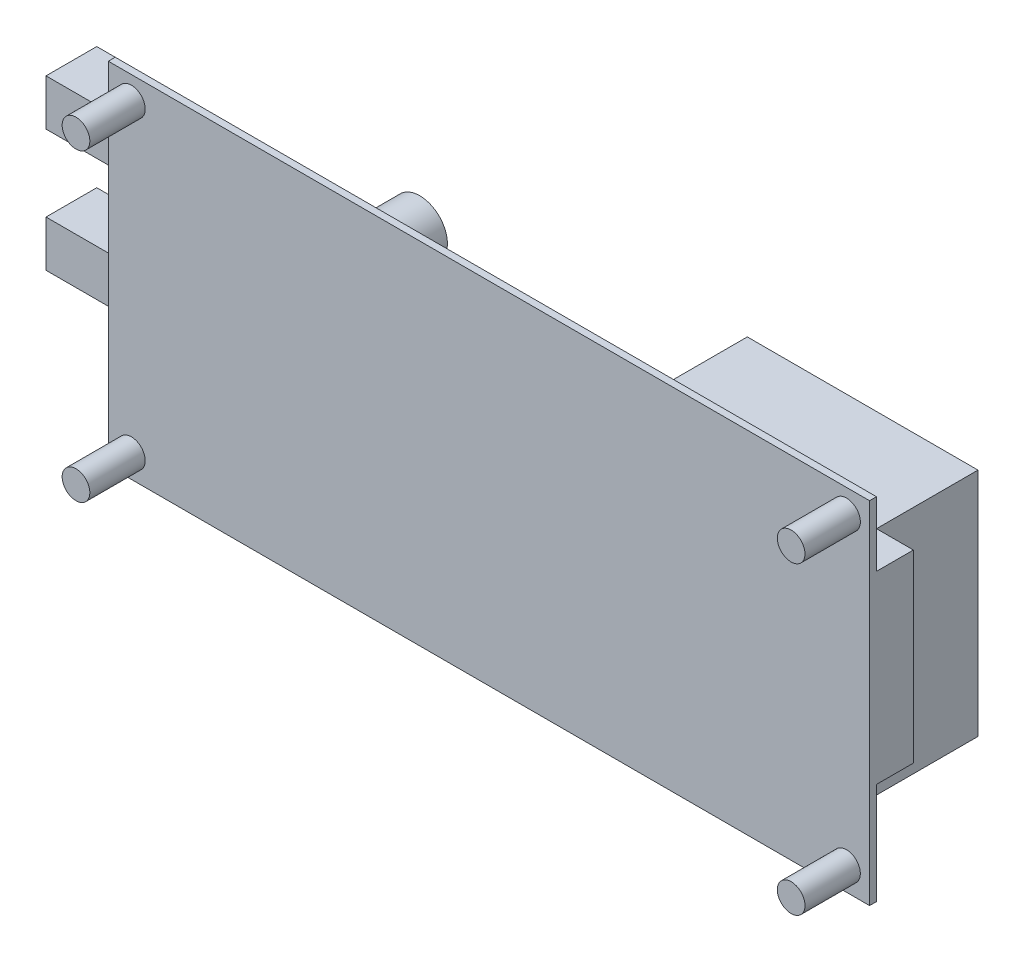
ISO-10303-21;
HEADER;
FILE_DESCRIPTION(('STEP AP214'),'2;1');
FILE_NAME('part.step','',(''),(''),'','','');
FILE_SCHEMA(('AUTOMOTIVE_DESIGN { 1 0 10303 214 1 1 1 1 }'));
ENDSEC;
DATA;
#1=APPLICATION_CONTEXT('core data for automotive mechanical design processes');
#2=APPLICATION_PROTOCOL_DEFINITION('international standard','automotive_design',2000,#1);
#3=PRODUCT_CONTEXT('',#1,'mechanical');
#4=PRODUCT('Part','Part','',(#3));
#5=PRODUCT_RELATED_PRODUCT_CATEGORY('part','',(#4));
#6=PRODUCT_DEFINITION_FORMATION('','',#4);
#7=PRODUCT_DEFINITION_CONTEXT('part definition',#1,'design');
#8=PRODUCT_DEFINITION('design','',#6,#7);
#9=PRODUCT_DEFINITION_SHAPE('','',#8);
#10=(LENGTH_UNIT() NAMED_UNIT(*) SI_UNIT(.MILLI.,.METRE.));
#11=(NAMED_UNIT(*) PLANE_ANGLE_UNIT() SI_UNIT($,.RADIAN.));
#12=(NAMED_UNIT(*) SI_UNIT($,.STERADIAN.) SOLID_ANGLE_UNIT());
#13=UNCERTAINTY_MEASURE_WITH_UNIT(LENGTH_MEASURE(1.E-05),#10,'distance_accuracy_value','');
#14=(GEOMETRIC_REPRESENTATION_CONTEXT(3) GLOBAL_UNCERTAINTY_ASSIGNED_CONTEXT((#13)) GLOBAL_UNIT_ASSIGNED_CONTEXT((#10,
#11,#12)) REPRESENTATION_CONTEXT('',''));
#15=CARTESIAN_POINT('',(0.,0.,0.));
#16=DIRECTION('',(0.,0.,1.));
#17=DIRECTION('',(1.,0.,0.));
#18=AXIS2_PLACEMENT_3D('',#15,#16,#17);
#19=CARTESIAN_POINT('',(0.,0.,0.));
#20=DIRECTION('',(0.,0.,1.));
#21=DIRECTION('',(1.,0.,0.));
#22=AXIS2_PLACEMENT_3D('',#19,#20,#21);
#23=PLANE('',#22);
#24=CARTESIAN_POINT('',(5.76130653266331,2.94723618090451,0.));
#25=DIRECTION('',(0.,0.,1.));
#26=DIRECTION('',(1.,0.,0.));
#27=AXIS2_PLACEMENT_3D('',#24,#25,#26);
#28=CIRCLE('',#27,6.);
#29=CARTESIAN_POINT('',(11.7613065326633,2.94723618090451,0.));
#30=VERTEX_POINT('',#29);
#31=EDGE_CURVE('E11',#30,#30,#28,.F.);
#32=ORIENTED_EDGE('',*,*,#31,.F.);
#33=EDGE_LOOP('',(#32));
#34=FACE_BOUND('',#33,.T.);
#35=CARTESIAN_POINT('',(-30.2386934673367,21.9472361809045,0.));
#36=DIRECTION('',(0.,0.,1.));
#37=DIRECTION('',(1.,0.,0.));
#38=AXIS2_PLACEMENT_3D('',#35,#36,#37);
#39=CIRCLE('',#38,1.5);
#40=CARTESIAN_POINT('',(-28.7386934673367,21.9472361809045,0.));
#41=VERTEX_POINT('',#40);
#42=EDGE_CURVE('E360',#41,#41,#39,.F.);
#43=ORIENTED_EDGE('',*,*,#42,.F.);
#44=EDGE_LOOP('',(#43));
#45=FACE_BOUND('',#44,.T.);
#46=CARTESIAN_POINT('',(-30.2386934673367,-44.0527638190955,0.));
#47=DIRECTION('',(0.,0.,1.));
#48=DIRECTION('',(1.,0.,0.));
#49=AXIS2_PLACEMENT_3D('',#46,#47,#48);
#50=CIRCLE('',#49,1.5);
#51=CARTESIAN_POINT('',(-28.7386934673367,-44.0527638190955,0.));
#52=VERTEX_POINT('',#51);
#53=EDGE_CURVE('E366',#52,#52,#50,.F.);
#54=ORIENTED_EDGE('',*,*,#53,.F.);
#55=EDGE_LOOP('',(#54));
#56=FACE_BOUND('',#55,.T.);
#57=CARTESIAN_POINT('',(124.761306532663,-44.0527638190955,0.));
#58=DIRECTION('',(0.,0.,1.));
#59=DIRECTION('',(1.,0.,0.));
#60=AXIS2_PLACEMENT_3D('',#57,#58,#59);
#61=CIRCLE('',#60,1.5);
#62=CARTESIAN_POINT('',(126.261306532663,-44.0527638190955,0.));
#63=VERTEX_POINT('',#62);
#64=EDGE_CURVE('E361',#63,#63,#61,.F.);
#65=ORIENTED_EDGE('',*,*,#64,.F.);
#66=EDGE_LOOP('',(#65));
#67=FACE_BOUND('',#66,.T.);
#68=CARTESIAN_POINT('',(124.761306532663,21.9472361809045,0.));
#69=DIRECTION('',(0.,0.,1.));
#70=DIRECTION('',(1.,0.,0.));
#71=AXIS2_PLACEMENT_3D('',#68,#69,#70);
#72=CIRCLE('',#71,1.5);
#73=CARTESIAN_POINT('',(126.261306532663,21.9472361809045,0.));
#74=VERTEX_POINT('',#73);
#75=EDGE_CURVE('E365',#74,#74,#72,.F.);
#76=ORIENTED_EDGE('',*,*,#75,.F.);
#77=EDGE_LOOP('',(#76));
#78=FACE_BOUND('',#77,.T.);
#79=DIRECTION('',(-1.,0.,0.));
#80=VECTOR('',#79,1.);
#81=CARTESIAN_POINT('',(-20.2386934673367,-20.5527638190955,0.));
#82=LINE('',#81,#80);
#83=CARTESIAN_POINT('',(-20.2386934673367,-20.5527638190955,0.));
#84=VERTEX_POINT('',#83);
#85=CARTESIAN_POINT('',(-35.2386934673367,-20.5527638190955,0.));
#86=VERTEX_POINT('',#85);
#87=EDGE_CURVE('E55',#84,#86,#82,.T.);
#88=ORIENTED_EDGE('',*,*,#87,.F.);
#89=DIRECTION('',(0.,-1.,0.));
#90=VECTOR('',#89,1.);
#91=CARTESIAN_POINT('',(-20.2386934673367,-20.5527638190955,0.));
#92=LINE('',#91,#90);
#93=CARTESIAN_POINT('',(-20.2386934673367,-10.5527638190955,0.));
#94=VERTEX_POINT('',#93);
#95=EDGE_CURVE('E220',#94,#84,#92,.T.);
#96=ORIENTED_EDGE('',*,*,#95,.F.);
#97=DIRECTION('',(1.,0.,0.));
#98=VECTOR('',#97,1.);
#99=CARTESIAN_POINT('',(-20.2386934673367,-10.5527638190955,0.));
#100=LINE('',#99,#98);
#101=CARTESIAN_POINT('',(-35.2386934673367,-10.5527638190955,0.));
#102=VERTEX_POINT('',#101);
#103=EDGE_CURVE('E532',#102,#94,#100,.T.);
#104=ORIENTED_EDGE('',*,*,#103,.F.);
#105=DIRECTION('',(0.,-1.,0.));
#106=VECTOR('',#105,1.);
#107=CARTESIAN_POINT('',(-35.2386934673367,26.9472361809045,0.));
#108=LINE('',#107,#106);
#109=CARTESIAN_POINT('',(-35.2386934673367,5.94723618090452,0.));
#110=VERTEX_POINT('',#109);
#111=EDGE_CURVE('E513',#110,#102,#108,.T.);
#112=ORIENTED_EDGE('',*,*,#111,.F.);
#113=DIRECTION('',(-1.,0.,0.));
#114=VECTOR('',#113,1.);
#115=CARTESIAN_POINT('',(-50.2386934673367,5.94723618090452,0.));
#116=LINE('',#115,#114);
#117=CARTESIAN_POINT('',(-20.2386934673367,5.94723618090451,0.));
#118=VERTEX_POINT('',#117);
#119=EDGE_CURVE('E63',#118,#110,#116,.T.);
#120=ORIENTED_EDGE('',*,*,#119,.F.);
#121=DIRECTION('',(0.,-1.,0.));
#122=VECTOR('',#121,1.);
#123=CARTESIAN_POINT('',(-20.2386934673367,5.94723618090451,0.));
#124=LINE('',#123,#122);
#125=CARTESIAN_POINT('',(-20.2386934673367,15.9472361809045,0.));
#126=VERTEX_POINT('',#125);
#127=EDGE_CURVE('E251',#126,#118,#124,.T.);
#128=ORIENTED_EDGE('',*,*,#127,.F.);
#129=DIRECTION('',(1.,0.,0.));
#130=VECTOR('',#129,1.);
#131=CARTESIAN_POINT('',(-50.2386934673367,15.9472361809045,0.));
#132=LINE('',#131,#130);
#133=CARTESIAN_POINT('',(-35.2386934673367,15.9472361809045,0.));
#134=VERTEX_POINT('',#133);
#135=EDGE_CURVE('E227',#134,#126,#132,.T.);
#136=ORIENTED_EDGE('',*,*,#135,.F.);
#137=CARTESIAN_POINT('',(-35.2386934673367,26.9472361809045,0.));
#138=VERTEX_POINT('',#137);
#139=EDGE_CURVE('E392',#138,#134,#108,.T.);
#140=ORIENTED_EDGE('',*,*,#139,.F.);
#141=DIRECTION('',(-1.,0.,0.));
#142=VECTOR('',#141,1.);
#143=CARTESIAN_POINT('',(-35.2386934673367,26.9472361809045,0.));
#144=LINE('',#143,#142);
#145=CARTESIAN_POINT('',(129.761306532663,26.9472361809045,0.));
#146=VERTEX_POINT('',#145);
#147=EDGE_CURVE('E382',#146,#138,#144,.T.);
#148=ORIENTED_EDGE('',*,*,#147,.F.);
#149=DIRECTION('',(0.,1.,0.));
#150=VECTOR('',#149,1.);
#151=CARTESIAN_POINT('',(129.761306532663,26.9472361809045,0.));
#152=LINE('',#151,#150);
#153=CARTESIAN_POINT('',(129.761306532663,12.9472361809045,0.));
#154=VERTEX_POINT('',#153);
#155=EDGE_CURVE('E400',#154,#146,#152,.T.);
#156=ORIENTED_EDGE('',*,*,#155,.F.);
#157=DIRECTION('',(1.,0.,0.));
#158=VECTOR('',#157,1.);
#159=CARTESIAN_POINT('',(129.761306532663,12.9472361809045,0.));
#160=LINE('',#159,#158);
#161=CARTESIAN_POINT('',(117.761306532663,12.9472361809045,0.));
#162=VERTEX_POINT('',#161);
#163=EDGE_CURVE('E330',#162,#154,#160,.T.);
#164=ORIENTED_EDGE('',*,*,#163,.F.);
#165=DIRECTION('',(0.,1.,0.));
#166=VECTOR('',#165,1.);
#167=CARTESIAN_POINT('',(117.761306532663,-27.0527638190955,0.));
#168=LINE('',#167,#166);
#169=CARTESIAN_POINT('',(117.761306532663,10.9472361809045,0.));
#170=VERTEX_POINT('',#169);
#171=EDGE_CURVE('E343',#170,#162,#168,.T.);
#172=ORIENTED_EDGE('',*,*,#171,.F.);
#173=DIRECTION('',(1.,0.,0.));
#174=VECTOR('',#173,1.);
#175=CARTESIAN_POINT('',(69.7613065326633,10.9472361809045,0.));
#176=LINE('',#175,#174);
#177=CARTESIAN_POINT('',(69.7613065326633,10.9472361809045,0.));
#178=VERTEX_POINT('',#177);
#179=EDGE_CURVE('E290',#178,#170,#176,.T.);
#180=ORIENTED_EDGE('',*,*,#179,.F.);
#181=DIRECTION('',(0.,1.,0.));
#182=VECTOR('',#181,1.);
#183=CARTESIAN_POINT('',(69.7613065326633,10.9472361809045,0.));
#184=LINE('',#183,#182);
#185=CARTESIAN_POINT('',(69.7613065326633,-39.0527638190955,0.));
#186=VERTEX_POINT('',#185);
#187=EDGE_CURVE('E271',#186,#178,#184,.T.);
#188=ORIENTED_EDGE('',*,*,#187,.F.);
#189=DIRECTION('',(-1.,0.,0.));
#190=VECTOR('',#189,1.);
#191=CARTESIAN_POINT('',(69.7613065326633,-39.0527638190955,0.));
#192=LINE('',#191,#190);
#193=CARTESIAN_POINT('',(119.761306532663,-39.0527638190955,0.));
#194=VERTEX_POINT('',#193);
#195=EDGE_CURVE('E277',#194,#186,#192,.T.);
#196=ORIENTED_EDGE('',*,*,#195,.F.);
#197=DIRECTION('',(0.,-1.,0.));
#198=VECTOR('',#197,1.);
#199=CARTESIAN_POINT('',(119.761306532663,10.9472361809045,0.));
#200=LINE('',#199,#198);
#201=CARTESIAN_POINT('',(119.761306532663,-27.0527638190955,0.));
#202=VERTEX_POINT('',#201);
#203=EDGE_CURVE('E294',#202,#194,#200,.T.);
#204=ORIENTED_EDGE('',*,*,#203,.F.);
#205=DIRECTION('',(-1.,0.,0.));
#206=VECTOR('',#205,1.);
#207=CARTESIAN_POINT('',(129.761306532663,-27.0527638190955,0.));
#208=LINE('',#207,#206);
#209=CARTESIAN_POINT('',(129.761306532663,-27.0527638190955,0.));
#210=VERTEX_POINT('',#209);
#211=EDGE_CURVE('E324',#210,#202,#208,.T.);
#212=ORIENTED_EDGE('',*,*,#211,.F.);
#213=CARTESIAN_POINT('',(129.761306532663,-49.0527638190955,0.));
#214=VERTEX_POINT('',#213);
#215=EDGE_CURVE('E401',#214,#210,#152,.T.);
#216=ORIENTED_EDGE('',*,*,#215,.F.);
#217=DIRECTION('',(1.,0.,0.));
#218=VECTOR('',#217,1.);
#219=CARTESIAN_POINT('',(-35.2386934673367,-49.0527638190955,0.));
#220=LINE('',#219,#218);
#221=CARTESIAN_POINT('',(-35.2386934673367,-49.0527638190955,0.));
#222=VERTEX_POINT('',#221);
#223=EDGE_CURVE('E396',#222,#214,#220,.T.);
#224=ORIENTED_EDGE('',*,*,#223,.F.);
#225=EDGE_CURVE('E376',#86,#222,#108,.T.);
#226=ORIENTED_EDGE('',*,*,#225,.F.);
#227=EDGE_LOOP('',(#88,#96,#104,#112,#120,#128,#136,#140,#148,#156,#164,#172,#180,#188,#196,
#204,#212,#216,#224,#226));
#228=FACE_BOUND('',#227,.T.);
#229=ADVANCED_FACE('F39',(#34,#45,#56,#67,#78,#228),#23,.F.);
#230=CARTESIAN_POINT('',(129.761306532663,-27.0527638190955,-8.));
#231=DIRECTION('',(0.,1.,0.));
#232=DIRECTION('',(0.,0.,1.));
#233=AXIS2_PLACEMENT_3D('',#230,#231,#232);
#234=PLANE('',#233);
#235=DIRECTION('',(0.,0.,1.));
#236=VECTOR('',#235,1.);
#237=CARTESIAN_POINT('',(119.761306532663,-27.0527638190955,-8.));
#238=LINE('',#237,#236);
#239=CARTESIAN_POINT('',(119.761306532663,-27.0527638190955,-8.));
#240=VERTEX_POINT('',#239);
#241=EDGE_CURVE('E316',#240,#202,#238,.T.);
#242=ORIENTED_EDGE('',*,*,#241,.F.);
#243=DIRECTION('',(-1.,0.,0.));
#244=VECTOR('',#243,1.);
#245=CARTESIAN_POINT('',(129.761306532663,-27.0527638190955,-8.));
#246=LINE('',#245,#244);
#247=CARTESIAN_POINT('',(129.761306532663,-27.0527638190955,-8.));
#248=VERTEX_POINT('',#247);
#249=EDGE_CURVE('E329',#248,#240,#246,.T.);
#250=ORIENTED_EDGE('',*,*,#249,.F.);
#251=DIRECTION('',(0.,0.,1.));
#252=VECTOR('',#251,1.);
#253=CARTESIAN_POINT('',(129.761306532663,-27.0527638190955,-8.));
#254=LINE('',#253,#252);
#255=EDGE_CURVE('E356',#248,#210,#254,.T.);
#256=ORIENTED_EDGE('',*,*,#255,.T.);
#257=ORIENTED_EDGE('',*,*,#211,.T.);
#258=EDGE_LOOP('',(#242,#250,#256,#257));
#259=FACE_BOUND('',#258,.T.);
#260=ADVANCED_FACE('F459',(#259),#234,.F.);
#261=CARTESIAN_POINT('',(117.761306532663,-27.0527638190955,-8.));
#262=DIRECTION('',(1.,0.,0.));
#263=DIRECTION('',(0.,0.,-1.));
#264=AXIS2_PLACEMENT_3D('',#261,#262,#263);
#265=PLANE('',#264);
#266=DIRECTION('',(0.,0.,-1.));
#267=VECTOR('',#266,1.);
#268=CARTESIAN_POINT('',(117.761306532663,10.9472361809045,-8.));
#269=LINE('',#268,#267);
#270=CARTESIAN_POINT('',(117.761306532663,10.9472361809045,-8.));
#271=VERTEX_POINT('',#270);
#272=EDGE_CURVE('E320',#170,#271,#269,.T.);
#273=ORIENTED_EDGE('',*,*,#272,.F.);
#274=ORIENTED_EDGE('',*,*,#171,.T.);
#275=DIRECTION('',(0.,0.,1.));
#276=VECTOR('',#275,1.);
#277=CARTESIAN_POINT('',(117.761306532663,12.9472361809045,-8.));
#278=LINE('',#277,#276);
#279=CARTESIAN_POINT('',(117.761306532663,12.9472361809045,-8.));
#280=VERTEX_POINT('',#279);
#281=EDGE_CURVE('E352',#280,#162,#278,.T.);
#282=ORIENTED_EDGE('',*,*,#281,.F.);
#283=DIRECTION('',(0.,1.,0.));
#284=VECTOR('',#283,1.);
#285=CARTESIAN_POINT('',(117.761306532663,-27.0527638190955,-8.));
#286=LINE('',#285,#284);
#287=EDGE_CURVE('E333',#271,#280,#286,.T.);
#288=ORIENTED_EDGE('',*,*,#287,.F.);
#289=EDGE_LOOP('',(#273,#274,#282,#288));
#290=FACE_BOUND('',#289,.T.);
#291=ADVANCED_FACE('F467',(#290),#265,.F.);
#292=CARTESIAN_POINT('',(0.,0.,-8.));
#293=DIRECTION('',(0.,0.,1.));
#294=DIRECTION('',(1.,0.,0.));
#295=AXIS2_PLACEMENT_3D('',#292,#293,#294);
#296=PLANE('',#295);
#297=DIRECTION('',(1.,0.,0.));
#298=VECTOR('',#297,1.);
#299=CARTESIAN_POINT('',(0.,10.9472361809045,-8.));
#300=LINE('',#299,#298);
#301=CARTESIAN_POINT('',(119.761306532663,10.9472361809045,-8.));
#302=VERTEX_POINT('',#301);
#303=EDGE_CURVE('E48',#271,#302,#300,.T.);
#304=ORIENTED_EDGE('',*,*,#303,.F.);
#305=ORIENTED_EDGE('',*,*,#287,.T.);
#306=DIRECTION('',(1.,0.,0.));
#307=VECTOR('',#306,1.);
#308=CARTESIAN_POINT('',(129.761306532663,12.9472361809045,-8.));
#309=LINE('',#308,#307);
#310=CARTESIAN_POINT('',(129.761306532663,12.9472361809045,-8.));
#311=VERTEX_POINT('',#310);
#312=EDGE_CURVE('E336',#280,#311,#309,.T.);
#313=ORIENTED_EDGE('',*,*,#312,.T.);
#314=DIRECTION('',(0.,-1.,0.));
#315=VECTOR('',#314,1.);
#316=CARTESIAN_POINT('',(129.761306532663,-27.0527638190955,-8.));
#317=LINE('',#316,#315);
#318=EDGE_CURVE('E325',#311,#248,#317,.T.);
#319=ORIENTED_EDGE('',*,*,#318,.T.);
#320=ORIENTED_EDGE('',*,*,#249,.T.);
#321=DIRECTION('',(0.,-1.,0.));
#322=VECTOR('',#321,1.);
#323=CARTESIAN_POINT('',(119.761306532663,0.,-8.));
#324=LINE('',#323,#322);
#325=EDGE_CURVE('E422',#302,#240,#324,.T.);
#326=ORIENTED_EDGE('',*,*,#325,.F.);
#327=EDGE_LOOP('',(#304,#305,#313,#319,#320,#326));
#328=FACE_BOUND('',#327,.T.);
#329=ADVANCED_FACE('F489',(#328),#296,.F.);
#330=CARTESIAN_POINT('',(-35.2386934673367,26.9472361809045,1.5));
#331=DIRECTION('',(1.,0.,0.));
#332=DIRECTION('',(0.,1.,0.));
#333=AXIS2_PLACEMENT_3D('',#330,#331,#332);
#334=PLANE('',#333);
#335=ORIENTED_EDGE('',*,*,#139,.T.);
#336=EDGE_CURVE('E397',#134,#110,#108,.T.);
#337=ORIENTED_EDGE('',*,*,#336,.T.);
#338=ORIENTED_EDGE('',*,*,#111,.T.);
#339=EDGE_CURVE('E516',#102,#86,#108,.T.);
#340=ORIENTED_EDGE('',*,*,#339,.T.);
#341=ORIENTED_EDGE('',*,*,#225,.T.);
#342=DIRECTION('',(0.,0.,-1.));
#343=VECTOR('',#342,1.);
#344=CARTESIAN_POINT('',(-35.2386934673367,-49.0527638190955,1.5));
#345=LINE('',#344,#343);
#346=CARTESIAN_POINT('',(-35.2386934673367,-49.0527638190955,1.5));
#347=VERTEX_POINT('',#346);
#348=EDGE_CURVE('E418',#347,#222,#345,.T.);
#349=ORIENTED_EDGE('',*,*,#348,.F.);
#350=DIRECTION('',(0.,-1.,0.));
#351=VECTOR('',#350,1.);
#352=CARTESIAN_POINT('',(-35.2386934673367,26.9472361809045,1.5));
#353=LINE('',#352,#351);
#354=CARTESIAN_POINT('',(-35.2386934673367,26.9472361809045,1.5));
#355=VERTEX_POINT('',#354);
#356=EDGE_CURVE('E377',#355,#347,#353,.T.);
#357=ORIENTED_EDGE('',*,*,#356,.F.);
#358=DIRECTION('',(0.,0.,-1.));
#359=VECTOR('',#358,1.);
#360=CARTESIAN_POINT('',(-35.2386934673367,26.9472361809045,1.5));
#361=LINE('',#360,#359);
#362=EDGE_CURVE('E391',#355,#138,#361,.T.);
#363=ORIENTED_EDGE('',*,*,#362,.T.);
#364=EDGE_LOOP('',(#335,#337,#338,#340,#341,#349,#357,#363));
#365=FACE_BOUND('',#364,.T.);
#366=ADVANCED_FACE('F41',(#365),#334,.F.);
#367=CARTESIAN_POINT('',(-35.2386934673367,-49.0527638190955,1.5));
#368=DIRECTION('',(0.,1.,0.));
#369=DIRECTION('',(0.,0.,1.));
#370=AXIS2_PLACEMENT_3D('',#367,#368,#369);
#371=PLANE('',#370);
#372=ORIENTED_EDGE('',*,*,#223,.T.);
#373=DIRECTION('',(0.,0.,-1.));
#374=VECTOR('',#373,1.);
#375=CARTESIAN_POINT('',(129.761306532663,-49.0527638190955,1.5));
#376=LINE('',#375,#374);
#377=CARTESIAN_POINT('',(129.761306532663,-49.0527638190955,1.5));
#378=VERTEX_POINT('',#377);
#379=EDGE_CURVE('E414',#378,#214,#376,.T.);
#380=ORIENTED_EDGE('',*,*,#379,.F.);
#381=DIRECTION('',(1.,0.,0.));
#382=VECTOR('',#381,1.);
#383=CARTESIAN_POINT('',(-35.2386934673367,-49.0527638190955,1.5));
#384=LINE('',#383,#382);
#385=EDGE_CURVE('E381',#347,#378,#384,.T.);
#386=ORIENTED_EDGE('',*,*,#385,.F.);
#387=ORIENTED_EDGE('',*,*,#348,.T.);
#388=EDGE_LOOP('',(#372,#380,#386,#387));
#389=FACE_BOUND('',#388,.T.);
#390=ADVANCED_FACE('F482',(#389),#371,.F.);
#391=CARTESIAN_POINT('',(129.761306532663,26.9472361809045,1.5));
#392=DIRECTION('',(-1.,0.,0.));
#393=DIRECTION('',(0.,0.,1.));
#394=AXIS2_PLACEMENT_3D('',#391,#392,#393);
#395=PLANE('',#394);
#396=ORIENTED_EDGE('',*,*,#215,.T.);
#397=ORIENTED_EDGE('',*,*,#255,.F.);
#398=ORIENTED_EDGE('',*,*,#318,.F.);
#399=DIRECTION('',(0.,0.,1.));
#400=VECTOR('',#399,1.);
#401=CARTESIAN_POINT('',(129.761306532663,12.9472361809045,-8.));
#402=LINE('',#401,#400);
#403=EDGE_CURVE('E339',#311,#154,#402,.T.);
#404=ORIENTED_EDGE('',*,*,#403,.T.);
#405=ORIENTED_EDGE('',*,*,#155,.T.);
#406=DIRECTION('',(0.,0.,-1.));
#407=VECTOR('',#406,1.);
#408=CARTESIAN_POINT('',(129.761306532663,26.9472361809045,1.5));
#409=LINE('',#408,#407);
#410=CARTESIAN_POINT('',(129.761306532663,26.9472361809045,1.5));
#411=VERTEX_POINT('',#410);
#412=EDGE_CURVE('E410',#411,#146,#409,.T.);
#413=ORIENTED_EDGE('',*,*,#412,.F.);
#414=DIRECTION('',(0.,1.,0.));
#415=VECTOR('',#414,1.);
#416=CARTESIAN_POINT('',(129.761306532663,26.9472361809045,1.5));
#417=LINE('',#416,#415);
#418=EDGE_CURVE('E385',#378,#411,#417,.T.);
#419=ORIENTED_EDGE('',*,*,#418,.F.);
#420=ORIENTED_EDGE('',*,*,#379,.T.);
#421=EDGE_LOOP('',(#396,#397,#398,#404,#405,#413,#419,#420));
#422=FACE_BOUND('',#421,.T.);
#423=ADVANCED_FACE('F479',(#422),#395,.F.);
#424=CARTESIAN_POINT('',(-35.2386934673367,26.9472361809045,1.5));
#425=DIRECTION('',(0.,-1.,0.));
#426=DIRECTION('',(0.,0.,-1.));
#427=AXIS2_PLACEMENT_3D('',#424,#425,#426);
#428=PLANE('',#427);
#429=ORIENTED_EDGE('',*,*,#147,.T.);
#430=ORIENTED_EDGE('',*,*,#362,.F.);
#431=DIRECTION('',(-1.,0.,0.));
#432=VECTOR('',#431,1.);
#433=CARTESIAN_POINT('',(-35.2386934673367,26.9472361809045,1.5));
#434=LINE('',#433,#432);
#435=EDGE_CURVE('E388',#411,#355,#434,.T.);
#436=ORIENTED_EDGE('',*,*,#435,.F.);
#437=ORIENTED_EDGE('',*,*,#412,.T.);
#438=EDGE_LOOP('',(#429,#430,#436,#437));
#439=FACE_BOUND('',#438,.T.);
#440=ADVANCED_FACE('F476',(#439),#428,.F.);
#441=CARTESIAN_POINT('',(0.,0.,1.5));
#442=DIRECTION('',(0.,0.,1.));
#443=DIRECTION('',(1.,0.,0.));
#444=AXIS2_PLACEMENT_3D('',#441,#442,#443);
#445=PLANE('',#444);
#446=CARTESIAN_POINT('',(-30.2386934673367,-44.0527638190955,1.5));
#447=DIRECTION('',(0.,0.,1.));
#448=DIRECTION('',(1.,0.,0.));
#449=AXIS2_PLACEMENT_3D('',#446,#447,#448);
#450=CIRCLE('',#449,2.99999999999999);
#451=CARTESIAN_POINT('',(-27.2386934673367,-44.0527638190955,1.5));
#452=VERTEX_POINT('',#451);
#453=EDGE_CURVE('E780',#452,#452,#450,.T.);
#454=ORIENTED_EDGE('',*,*,#453,.F.);
#455=EDGE_LOOP('',(#454));
#456=FACE_BOUND('',#455,.T.);
#457=CARTESIAN_POINT('',(124.761306532663,-44.0527638190955,1.5));
#458=DIRECTION('',(0.,0.,1.));
#459=DIRECTION('',(-1.,0.,0.));
#460=AXIS2_PLACEMENT_3D('',#457,#458,#459);
#461=CIRCLE('',#460,2.99999999999999);
#462=CARTESIAN_POINT('',(121.761306532663,-44.0527638190955,1.5));
#463=VERTEX_POINT('',#462);
#464=EDGE_CURVE('E785',#463,#463,#461,.T.);
#465=ORIENTED_EDGE('',*,*,#464,.F.);
#466=EDGE_LOOP('',(#465));
#467=FACE_BOUND('',#466,.T.);
#468=CARTESIAN_POINT('',(-30.2386934673367,21.9472361809045,1.5));
#469=DIRECTION('',(0.,0.,1.));
#470=DIRECTION('',(-1.,0.,0.));
#471=AXIS2_PLACEMENT_3D('',#468,#469,#470);
#472=CIRCLE('',#471,2.99999999999999);
#473=CARTESIAN_POINT('',(-33.2386934673367,21.9472361809045,1.5));
#474=VERTEX_POINT('',#473);
#475=EDGE_CURVE('E801',#474,#474,#472,.T.);
#476=ORIENTED_EDGE('',*,*,#475,.F.);
#477=EDGE_LOOP('',(#476));
#478=FACE_BOUND('',#477,.T.);
#479=CARTESIAN_POINT('',(124.761306532663,21.9472361809045,1.5));
#480=DIRECTION('',(0.,0.,1.));
#481=DIRECTION('',(1.,0.,0.));
#482=AXIS2_PLACEMENT_3D('',#479,#480,#481);
#483=CIRCLE('',#482,2.99999999999999);
#484=CARTESIAN_POINT('',(127.761306532663,21.9472361809045,1.5));
#485=VERTEX_POINT('',#484);
#486=EDGE_CURVE('E813',#485,#485,#483,.T.);
#487=ORIENTED_EDGE('',*,*,#486,.F.);
#488=EDGE_LOOP('',(#487));
#489=FACE_BOUND('',#488,.T.);
#490=ORIENTED_EDGE('',*,*,#356,.T.);
#491=ORIENTED_EDGE('',*,*,#385,.T.);
#492=ORIENTED_EDGE('',*,*,#418,.T.);
#493=ORIENTED_EDGE('',*,*,#435,.T.);
#494=EDGE_LOOP('',(#490,#491,#492,#493));
#495=FACE_BOUND('',#494,.T.);
#496=ADVANCED_FACE('F474',(#456,#467,#478,#489,#495),#445,.T.);
#497=CARTESIAN_POINT('',(124.761306532663,21.9472361809045,-0.000999999999999916));
#498=DIRECTION('',(0.,0.,1.));
#499=DIRECTION('',(1.,0.,0.));
#500=AXIS2_PLACEMENT_3D('',#497,#498,#499);
#501=CYLINDRICAL_SURFACE('',#500,1.5);
#502=CARTESIAN_POINT('',(124.761306532663,21.9472361809045,1.5));
#503=DIRECTION('',(0.,0.,1.));
#504=DIRECTION('',(1.,0.,0.));
#505=AXIS2_PLACEMENT_3D('',#502,#503,#504);
#506=CIRCLE('',#505,1.5);
#507=CARTESIAN_POINT('',(126.261306532663,21.9472361809045,1.5));
#508=VERTEX_POINT('',#507);
#509=EDGE_CURVE('E818',#508,#508,#506,.F.);
#510=ORIENTED_EDGE('',*,*,#509,.F.);
#511=EDGE_LOOP('',(#510));
#512=FACE_BOUND('',#511,.T.);
#513=ORIENTED_EDGE('',*,*,#75,.T.);
#514=EDGE_LOOP('',(#513));
#515=FACE_BOUND('',#514,.T.);
#516=ADVANCED_FACE('F855',(#512,#515),#501,.F.);
#517=CARTESIAN_POINT('',(124.761306532663,-44.0527638190955,-0.000999999999999916));
#518=DIRECTION('',(0.,0.,1.));
#519=DIRECTION('',(1.,0.,0.));
#520=AXIS2_PLACEMENT_3D('',#517,#518,#519);
#521=CYLINDRICAL_SURFACE('',#520,1.5);
#522=CARTESIAN_POINT('',(124.761306532663,-44.0527638190955,1.5));
#523=DIRECTION('',(0.,0.,-1.));
#524=DIRECTION('',(-1.,0.,0.));
#525=AXIS2_PLACEMENT_3D('',#522,#523,#524);
#526=CIRCLE('',#525,1.5);
#527=CARTESIAN_POINT('',(123.261306532663,-44.0527638190955,1.5));
#528=VERTEX_POINT('',#527);
#529=EDGE_CURVE('E794',#528,#528,#526,.F.);
#530=ORIENTED_EDGE('',*,*,#529,.T.);
#531=EDGE_LOOP('',(#530));
#532=FACE_BOUND('',#531,.T.);
#533=ORIENTED_EDGE('',*,*,#64,.T.);
#534=EDGE_LOOP('',(#533));
#535=FACE_BOUND('',#534,.T.);
#536=ADVANCED_FACE('F860',(#532,#535),#521,.F.);
#537=CARTESIAN_POINT('',(-30.2386934673367,-44.0527638190955,-0.000999999999999916));
#538=DIRECTION('',(0.,0.,1.));
#539=DIRECTION('',(1.,0.,0.));
#540=AXIS2_PLACEMENT_3D('',#537,#538,#539);
#541=CYLINDRICAL_SURFACE('',#540,1.5);
#542=CARTESIAN_POINT('',(-30.2386934673367,-44.0527638190955,1.5));
#543=DIRECTION('',(0.,0.,1.));
#544=DIRECTION('',(1.,0.,0.));
#545=AXIS2_PLACEMENT_3D('',#542,#543,#544);
#546=CIRCLE('',#545,1.5);
#547=CARTESIAN_POINT('',(-28.7386934673367,-44.0527638190955,1.5));
#548=VERTEX_POINT('',#547);
#549=EDGE_CURVE('E779',#548,#548,#546,.F.);
#550=ORIENTED_EDGE('',*,*,#549,.F.);
#551=EDGE_LOOP('',(#550));
#552=FACE_BOUND('',#551,.T.);
#553=ORIENTED_EDGE('',*,*,#53,.T.);
#554=EDGE_LOOP('',(#553));
#555=FACE_BOUND('',#554,.T.);
#556=ADVANCED_FACE('F876',(#552,#555),#541,.F.);
#557=CARTESIAN_POINT('',(-30.2386934673367,21.9472361809045,-0.000999999999999916));
#558=DIRECTION('',(0.,0.,1.));
#559=DIRECTION('',(1.,0.,0.));
#560=AXIS2_PLACEMENT_3D('',#557,#558,#559);
#561=CYLINDRICAL_SURFACE('',#560,1.5);
#562=CARTESIAN_POINT('',(-30.2386934673367,21.9472361809045,1.5));
#563=DIRECTION('',(0.,0.,-1.));
#564=DIRECTION('',(-1.,0.,0.));
#565=AXIS2_PLACEMENT_3D('',#562,#563,#564);
#566=CIRCLE('',#565,1.5);
#567=CARTESIAN_POINT('',(-31.7386934673367,21.9472361809045,1.5));
#568=VERTEX_POINT('',#567);
#569=EDGE_CURVE('E806',#568,#568,#566,.F.);
#570=ORIENTED_EDGE('',*,*,#569,.T.);
#571=EDGE_LOOP('',(#570));
#572=FACE_BOUND('',#571,.T.);
#573=ORIENTED_EDGE('',*,*,#42,.T.);
#574=EDGE_LOOP('',(#573));
#575=FACE_BOUND('',#574,.T.);
#576=ADVANCED_FACE('F882',(#572,#575),#561,.F.);
#577=CARTESIAN_POINT('',(129.761306532663,12.9472361809045,-8.));
#578=DIRECTION('',(0.,-1.,0.));
#579=DIRECTION('',(1.,0.,0.));
#580=AXIS2_PLACEMENT_3D('',#577,#578,#579);
#581=PLANE('',#580);
#582=ORIENTED_EDGE('',*,*,#163,.T.);
#583=ORIENTED_EDGE('',*,*,#403,.F.);
#584=ORIENTED_EDGE('',*,*,#312,.F.);
#585=ORIENTED_EDGE('',*,*,#281,.T.);
#586=EDGE_LOOP('',(#582,#583,#584,#585));
#587=FACE_BOUND('',#586,.T.);
#588=ADVANCED_FACE('F505',(#587),#581,.F.);
#589=CARTESIAN_POINT('',(69.7613065326633,10.9472361809045,-32.));
#590=DIRECTION('',(0.,-1.,0.));
#591=DIRECTION('',(1.,0.,0.));
#592=AXIS2_PLACEMENT_3D('',#589,#590,#591);
#593=PLANE('',#592);
#594=ORIENTED_EDGE('',*,*,#179,.T.);
#595=ORIENTED_EDGE('',*,*,#272,.T.);
#596=ORIENTED_EDGE('',*,*,#303,.T.);
#597=DIRECTION('',(0.,0.,1.));
#598=VECTOR('',#597,1.);
#599=CARTESIAN_POINT('',(119.761306532663,10.9472361809045,-32.));
#600=LINE('',#599,#598);
#601=CARTESIAN_POINT('',(119.761306532663,10.9472361809045,-32.));
#602=VERTEX_POINT('',#601);
#603=EDGE_CURVE('E308',#602,#302,#600,.T.);
#604=ORIENTED_EDGE('',*,*,#603,.F.);
#605=DIRECTION('',(1.,0.,0.));
#606=VECTOR('',#605,1.);
#607=CARTESIAN_POINT('',(69.7613065326633,10.9472361809045,-32.));
#608=LINE('',#607,#606);
#609=CARTESIAN_POINT('',(69.7613065326633,10.9472361809045,-32.));
#610=VERTEX_POINT('',#609);
#611=EDGE_CURVE('E276',#610,#602,#608,.T.);
#612=ORIENTED_EDGE('',*,*,#611,.F.);
#613=DIRECTION('',(0.,0.,1.));
#614=VECTOR('',#613,1.);
#615=CARTESIAN_POINT('',(69.7613065326633,10.9472361809045,-32.));
#616=LINE('',#615,#614);
#617=EDGE_CURVE('E312',#610,#178,#616,.T.);
#618=ORIENTED_EDGE('',*,*,#617,.T.);
#619=EDGE_LOOP('',(#594,#595,#596,#604,#612,#618));
#620=FACE_BOUND('',#619,.T.);
#621=ADVANCED_FACE('F429',(#620),#593,.F.);
#622=CARTESIAN_POINT('',(119.761306532663,10.9472361809045,-32.));
#623=DIRECTION('',(-1.,0.,0.));
#624=DIRECTION('',(0.,0.,1.));
#625=AXIS2_PLACEMENT_3D('',#622,#623,#624);
#626=PLANE('',#625);
#627=ORIENTED_EDGE('',*,*,#325,.T.);
#628=ORIENTED_EDGE('',*,*,#241,.T.);
#629=ORIENTED_EDGE('',*,*,#203,.T.);
#630=DIRECTION('',(0.,0.,1.));
#631=VECTOR('',#630,1.);
#632=CARTESIAN_POINT('',(119.761306532663,-39.0527638190955,-32.));
#633=LINE('',#632,#631);
#634=CARTESIAN_POINT('',(119.761306532663,-39.0527638190955,-32.));
#635=VERTEX_POINT('',#634);
#636=EDGE_CURVE('E304',#635,#194,#633,.T.);
#637=ORIENTED_EDGE('',*,*,#636,.F.);
#638=DIRECTION('',(0.,-1.,0.));
#639=VECTOR('',#638,1.);
#640=CARTESIAN_POINT('',(119.761306532663,10.9472361809045,-32.));
#641=LINE('',#640,#639);
#642=EDGE_CURVE('E280',#602,#635,#641,.T.);
#643=ORIENTED_EDGE('',*,*,#642,.F.);
#644=ORIENTED_EDGE('',*,*,#603,.T.);
#645=EDGE_LOOP('',(#627,#628,#629,#637,#643,#644));
#646=FACE_BOUND('',#645,.T.);
#647=ADVANCED_FACE('F434',(#646),#626,.F.);
#648=CARTESIAN_POINT('',(69.7613065326633,10.9472361809045,-32.));
#649=DIRECTION('',(1.,0.,0.));
#650=DIRECTION('',(0.,0.,-1.));
#651=AXIS2_PLACEMENT_3D('',#648,#649,#650);
#652=PLANE('',#651);
#653=ORIENTED_EDGE('',*,*,#187,.T.);
#654=ORIENTED_EDGE('',*,*,#617,.F.);
#655=DIRECTION('',(0.,1.,0.));
#656=VECTOR('',#655,1.);
#657=CARTESIAN_POINT('',(69.7613065326633,10.9472361809045,-32.));
#658=LINE('',#657,#656);
#659=CARTESIAN_POINT('',(69.7613065326633,-39.0527638190955,-32.));
#660=VERTEX_POINT('',#659);
#661=EDGE_CURVE('E272',#660,#610,#658,.T.);
#662=ORIENTED_EDGE('',*,*,#661,.F.);
#663=DIRECTION('',(0.,0.,1.));
#664=VECTOR('',#663,1.);
#665=CARTESIAN_POINT('',(69.7613065326633,-39.0527638190955,-32.));
#666=LINE('',#665,#664);
#667=EDGE_CURVE('E286',#660,#186,#666,.T.);
#668=ORIENTED_EDGE('',*,*,#667,.T.);
#669=EDGE_LOOP('',(#653,#654,#662,#668));
#670=FACE_BOUND('',#669,.T.);
#671=ADVANCED_FACE('F443',(#670),#652,.F.);
#672=CARTESIAN_POINT('',(69.7613065326633,-39.0527638190955,-32.));
#673=DIRECTION('',(0.,1.,0.));
#674=DIRECTION('',(-1.,0.,0.));
#675=AXIS2_PLACEMENT_3D('',#672,#673,#674);
#676=PLANE('',#675);
#677=ORIENTED_EDGE('',*,*,#195,.T.);
#678=ORIENTED_EDGE('',*,*,#667,.F.);
#679=DIRECTION('',(-1.,0.,0.));
#680=VECTOR('',#679,1.);
#681=CARTESIAN_POINT('',(69.7613065326633,-39.0527638190955,-32.));
#682=LINE('',#681,#680);
#683=EDGE_CURVE('E283',#635,#660,#682,.T.);
#684=ORIENTED_EDGE('',*,*,#683,.F.);
#685=ORIENTED_EDGE('',*,*,#636,.T.);
#686=EDGE_LOOP('',(#677,#678,#684,#685));
#687=FACE_BOUND('',#686,.T.);
#688=ADVANCED_FACE('F447',(#687),#676,.F.);
#689=CARTESIAN_POINT('',(0.,0.,-32.));
#690=DIRECTION('',(0.,0.,1.));
#691=DIRECTION('',(1.,0.,0.));
#692=AXIS2_PLACEMENT_3D('',#689,#690,#691);
#693=PLANE('',#692);
#694=ORIENTED_EDGE('',*,*,#661,.T.);
#695=ORIENTED_EDGE('',*,*,#611,.T.);
#696=ORIENTED_EDGE('',*,*,#642,.T.);
#697=ORIENTED_EDGE('',*,*,#683,.T.);
#698=EDGE_LOOP('',(#694,#695,#696,#697));
#699=FACE_BOUND('',#698,.T.);
#700=ADVANCED_FACE('F438',(#699),#693,.F.);
#701=CARTESIAN_POINT('',(0.,0.,0.));
#702=DIRECTION('',(0.,0.,-1.));
#703=DIRECTION('',(-1.,0.,0.));
#704=AXIS2_PLACEMENT_3D('',#701,#702,#703);
#705=PLANE('',#704);
#706=CARTESIAN_POINT('',(-50.2386934673367,5.94723618090452,0.));
#707=VERTEX_POINT('',#706);
#708=EDGE_CURVE('E254',#110,#707,#116,.T.);
#709=ORIENTED_EDGE('',*,*,#708,.F.);
#710=ORIENTED_EDGE('',*,*,#336,.F.);
#711=CARTESIAN_POINT('',(-50.2386934673367,15.9472361809045,0.));
#712=VERTEX_POINT('',#711);
#713=EDGE_CURVE('E247',#712,#134,#132,.T.);
#714=ORIENTED_EDGE('',*,*,#713,.F.);
#715=DIRECTION('',(0.,1.,0.));
#716=VECTOR('',#715,1.);
#717=CARTESIAN_POINT('',(-50.2386934673367,5.94723618090452,0.));
#718=LINE('',#717,#716);
#719=EDGE_CURVE('E222',#707,#712,#718,.T.);
#720=ORIENTED_EDGE('',*,*,#719,.F.);
#721=EDGE_LOOP('',(#709,#710,#714,#720));
#722=FACE_BOUND('',#721,.T.);
#723=ADVANCED_FACE('F454',(#722),#705,.F.);
#724=CARTESIAN_POINT('',(-50.2386934673367,5.94723618090452,-11.));
#725=DIRECTION('',(1.,0.,0.));
#726=DIRECTION('',(0.,0.,-1.));
#727=AXIS2_PLACEMENT_3D('',#724,#725,#726);
#728=PLANE('',#727);
#729=ORIENTED_EDGE('',*,*,#719,.T.);
#730=DIRECTION('',(0.,0.,1.));
#731=VECTOR('',#730,1.);
#732=CARTESIAN_POINT('',(-50.2386934673367,15.9472361809045,-11.));
#733=LINE('',#732,#731);
#734=CARTESIAN_POINT('',(-50.2386934673367,15.9472361809045,-11.));
#735=VERTEX_POINT('',#734);
#736=EDGE_CURVE('E267',#735,#712,#733,.T.);
#737=ORIENTED_EDGE('',*,*,#736,.F.);
#738=DIRECTION('',(0.,1.,0.));
#739=VECTOR('',#738,1.);
#740=CARTESIAN_POINT('',(-50.2386934673367,5.94723618090452,-11.));
#741=LINE('',#740,#739);
#742=CARTESIAN_POINT('',(-50.2386934673367,5.94723618090452,-11.));
#743=VERTEX_POINT('',#742);
#744=EDGE_CURVE('E233',#743,#735,#741,.T.);
#745=ORIENTED_EDGE('',*,*,#744,.F.);
#746=DIRECTION('',(0.,0.,1.));
#747=VECTOR('',#746,1.);
#748=CARTESIAN_POINT('',(-50.2386934673367,5.94723618090452,-11.));
#749=LINE('',#748,#747);
#750=EDGE_CURVE('E245',#743,#707,#749,.T.);
#751=ORIENTED_EDGE('',*,*,#750,.T.);
#752=EDGE_LOOP('',(#729,#737,#745,#751));
#753=FACE_BOUND('',#752,.T.);
#754=ADVANCED_FACE('F540',(#753),#728,.F.);
#755=CARTESIAN_POINT('',(-50.2386934673367,15.9472361809045,-11.));
#756=DIRECTION('',(0.,-1.,0.));
#757=DIRECTION('',(1.,0.,0.));
#758=AXIS2_PLACEMENT_3D('',#755,#756,#757);
#759=PLANE('',#758);
#760=ORIENTED_EDGE('',*,*,#713,.T.);
#761=ORIENTED_EDGE('',*,*,#135,.T.);
#762=DIRECTION('',(0.,0.,1.));
#763=VECTOR('',#762,1.);
#764=CARTESIAN_POINT('',(-20.2386934673367,15.9472361809045,-11.));
#765=LINE('',#764,#763);
#766=CARTESIAN_POINT('',(-20.2386934673367,15.9472361809045,-11.));
#767=VERTEX_POINT('',#766);
#768=EDGE_CURVE('E263',#767,#126,#765,.T.);
#769=ORIENTED_EDGE('',*,*,#768,.F.);
#770=DIRECTION('',(1.,0.,0.));
#771=VECTOR('',#770,1.);
#772=CARTESIAN_POINT('',(-50.2386934673367,15.9472361809045,-11.));
#773=LINE('',#772,#771);
#774=EDGE_CURVE('E237',#735,#767,#773,.T.);
#775=ORIENTED_EDGE('',*,*,#774,.F.);
#776=ORIENTED_EDGE('',*,*,#736,.T.);
#777=EDGE_LOOP('',(#760,#761,#769,#775,#776));
#778=FACE_BOUND('',#777,.T.);
#779=ADVANCED_FACE('F524',(#778),#759,.F.);
#780=CARTESIAN_POINT('',(-20.2386934673367,5.94723618090451,-11.));
#781=DIRECTION('',(-1.,0.,0.));
#782=DIRECTION('',(0.,-1.,0.));
#783=AXIS2_PLACEMENT_3D('',#780,#781,#782);
#784=PLANE('',#783);
#785=ORIENTED_EDGE('',*,*,#127,.T.);
#786=DIRECTION('',(0.,0.,1.));
#787=VECTOR('',#786,1.);
#788=CARTESIAN_POINT('',(-20.2386934673367,5.94723618090451,-11.));
#789=LINE('',#788,#787);
#790=CARTESIAN_POINT('',(-20.2386934673367,5.94723618090451,-11.));
#791=VERTEX_POINT('',#790);
#792=EDGE_CURVE('E260',#791,#118,#789,.T.);
#793=ORIENTED_EDGE('',*,*,#792,.F.);
#794=DIRECTION('',(0.,-1.,0.));
#795=VECTOR('',#794,1.);
#796=CARTESIAN_POINT('',(-20.2386934673367,5.94723618090451,-11.));
#797=LINE('',#796,#795);
#798=EDGE_CURVE('E240',#767,#791,#797,.T.);
#799=ORIENTED_EDGE('',*,*,#798,.F.);
#800=ORIENTED_EDGE('',*,*,#768,.T.);
#801=EDGE_LOOP('',(#785,#793,#799,#800));
#802=FACE_BOUND('',#801,.T.);
#803=ADVANCED_FACE('F528',(#802),#784,.F.);
#804=CARTESIAN_POINT('',(-50.2386934673367,5.94723618090452,-11.));
#805=DIRECTION('',(0.,1.,0.));
#806=DIRECTION('',(-1.,0.,0.));
#807=AXIS2_PLACEMENT_3D('',#804,#805,#806);
#808=PLANE('',#807);
#809=ORIENTED_EDGE('',*,*,#119,.T.);
#810=ORIENTED_EDGE('',*,*,#708,.T.);
#811=ORIENTED_EDGE('',*,*,#750,.F.);
#812=DIRECTION('',(-1.,0.,0.));
#813=VECTOR('',#812,1.);
#814=CARTESIAN_POINT('',(-50.2386934673367,5.94723618090452,-11.));
#815=LINE('',#814,#813);
#816=EDGE_CURVE('E243',#791,#743,#815,.T.);
#817=ORIENTED_EDGE('',*,*,#816,.F.);
#818=ORIENTED_EDGE('',*,*,#792,.T.);
#819=EDGE_LOOP('',(#809,#810,#811,#817,#818));
#820=FACE_BOUND('',#819,.T.);
#821=ADVANCED_FACE('F536',(#820),#808,.F.);
#822=CARTESIAN_POINT('',(0.,0.,-11.));
#823=DIRECTION('',(0.,0.,-1.));
#824=DIRECTION('',(-1.,0.,0.));
#825=AXIS2_PLACEMENT_3D('',#822,#823,#824);
#826=PLANE('',#825);
#827=ORIENTED_EDGE('',*,*,#744,.T.);
#828=ORIENTED_EDGE('',*,*,#774,.T.);
#829=ORIENTED_EDGE('',*,*,#798,.T.);
#830=ORIENTED_EDGE('',*,*,#816,.T.);
#831=EDGE_LOOP('',(#827,#828,#829,#830));
#832=FACE_BOUND('',#831,.T.);
#833=ADVANCED_FACE('F543',(#832),#826,.T.);
#834=CARTESIAN_POINT('',(0.,0.,0.));
#835=DIRECTION('',(0.,0.,1.));
#836=DIRECTION('',(1.,0.,0.));
#837=AXIS2_PLACEMENT_3D('',#834,#835,#836);
#838=PLANE('',#837);
#839=ORIENTED_EDGE('',*,*,#339,.F.);
#840=CARTESIAN_POINT('',(-50.2386934673367,-10.5527638190955,0.));
#841=VERTEX_POINT('',#840);
#842=EDGE_CURVE('E216',#841,#102,#100,.T.);
#843=ORIENTED_EDGE('',*,*,#842,.F.);
#844=DIRECTION('',(0.,1.,0.));
#845=VECTOR('',#844,1.);
#846=CARTESIAN_POINT('',(-50.2386934673367,-20.5527638190955,0.));
#847=LINE('',#846,#845);
#848=CARTESIAN_POINT('',(-50.2386934673367,-20.5527638190955,0.));
#849=VERTEX_POINT('',#848);
#850=EDGE_CURVE('E839',#849,#841,#847,.T.);
#851=ORIENTED_EDGE('',*,*,#850,.F.);
#852=EDGE_CURVE('E836',#86,#849,#82,.T.);
#853=ORIENTED_EDGE('',*,*,#852,.F.);
#854=EDGE_LOOP('',(#839,#843,#851,#853));
#855=FACE_BOUND('',#854,.T.);
#856=ADVANCED_FACE('F545',(#855),#838,.T.);
#857=CARTESIAN_POINT('',(-20.2386934673367,-20.5527638190955,-11.));
#858=DIRECTION('',(-1.,0.,0.));
#859=DIRECTION('',(0.,0.,1.));
#860=AXIS2_PLACEMENT_3D('',#857,#858,#859);
#861=PLANE('',#860);
#862=ORIENTED_EDGE('',*,*,#95,.T.);
#863=DIRECTION('',(0.,0.,1.));
#864=VECTOR('',#863,1.);
#865=CARTESIAN_POINT('',(-20.2386934673367,-20.5527638190955,-11.));
#866=LINE('',#865,#864);
#867=CARTESIAN_POINT('',(-20.2386934673367,-20.5527638190955,-11.));
#868=VERTEX_POINT('',#867);
#869=EDGE_CURVE('E198',#868,#84,#866,.T.);
#870=ORIENTED_EDGE('',*,*,#869,.F.);
#871=DIRECTION('',(0.,-1.,0.));
#872=VECTOR('',#871,1.);
#873=CARTESIAN_POINT('',(-20.2386934673367,-20.5527638190955,-11.));
#874=LINE('',#873,#872);
#875=CARTESIAN_POINT('',(-20.2386934673367,-10.5527638190955,-11.));
#876=VERTEX_POINT('',#875);
#877=EDGE_CURVE('E206',#876,#868,#874,.T.);
#878=ORIENTED_EDGE('',*,*,#877,.F.);
#879=DIRECTION('',(0.,0.,1.));
#880=VECTOR('',#879,1.);
#881=CARTESIAN_POINT('',(-20.2386934673367,-10.5527638190955,-11.));
#882=LINE('',#881,#880);
#883=EDGE_CURVE('E833',#876,#94,#882,.T.);
#884=ORIENTED_EDGE('',*,*,#883,.T.);
#885=EDGE_LOOP('',(#862,#870,#878,#884));
#886=FACE_BOUND('',#885,.T.);
#887=ADVANCED_FACE('F218',(#886),#861,.F.);
#888=CARTESIAN_POINT('',(-20.2386934673367,-20.5527638190955,-11.));
#889=DIRECTION('',(0.,1.,0.));
#890=DIRECTION('',(0.,0.,1.));
#891=AXIS2_PLACEMENT_3D('',#888,#889,#890);
#892=PLANE('',#891);
#893=ORIENTED_EDGE('',*,*,#87,.T.);
#894=ORIENTED_EDGE('',*,*,#852,.T.);
#895=DIRECTION('',(0.,0.,1.));
#896=VECTOR('',#895,1.);
#897=CARTESIAN_POINT('',(-50.2386934673367,-20.5527638190955,-11.));
#898=LINE('',#897,#896);
#899=CARTESIAN_POINT('',(-50.2386934673367,-20.5527638190955,-11.));
#900=VERTEX_POINT('',#899);
#901=EDGE_CURVE('E201',#900,#849,#898,.T.);
#902=ORIENTED_EDGE('',*,*,#901,.F.);
#903=DIRECTION('',(-1.,0.,0.));
#904=VECTOR('',#903,1.);
#905=CARTESIAN_POINT('',(-20.2386934673367,-20.5527638190955,-11.));
#906=LINE('',#905,#904);
#907=EDGE_CURVE('E194',#868,#900,#906,.T.);
#908=ORIENTED_EDGE('',*,*,#907,.F.);
#909=ORIENTED_EDGE('',*,*,#869,.T.);
#910=EDGE_LOOP('',(#893,#894,#902,#908,#909));
#911=FACE_BOUND('',#910,.T.);
#912=ADVANCED_FACE('F196',(#911),#892,.F.);
#913=CARTESIAN_POINT('',(-50.2386934673367,-20.5527638190955,-11.));
#914=DIRECTION('',(1.,0.,0.));
#915=DIRECTION('',(0.,0.,-1.));
#916=AXIS2_PLACEMENT_3D('',#913,#914,#915);
#917=PLANE('',#916);
#918=ORIENTED_EDGE('',*,*,#850,.T.);
#919=DIRECTION('',(0.,0.,1.));
#920=VECTOR('',#919,1.);
#921=CARTESIAN_POINT('',(-50.2386934673367,-10.5527638190955,-11.));
#922=LINE('',#921,#920);
#923=CARTESIAN_POINT('',(-50.2386934673367,-10.5527638190955,-11.));
#924=VERTEX_POINT('',#923);
#925=EDGE_CURVE('E229',#924,#841,#922,.T.);
#926=ORIENTED_EDGE('',*,*,#925,.F.);
#927=DIRECTION('',(0.,1.,0.));
#928=VECTOR('',#927,1.);
#929=CARTESIAN_POINT('',(-50.2386934673367,-20.5527638190955,-11.));
#930=LINE('',#929,#928);
#931=EDGE_CURVE('E205',#900,#924,#930,.T.);
#932=ORIENTED_EDGE('',*,*,#931,.F.);
#933=ORIENTED_EDGE('',*,*,#901,.T.);
#934=EDGE_LOOP('',(#918,#926,#932,#933));
#935=FACE_BOUND('',#934,.T.);
#936=ADVANCED_FACE('F606',(#935),#917,.F.);
#937=CARTESIAN_POINT('',(-20.2386934673367,-10.5527638190955,-11.));
#938=DIRECTION('',(0.,-1.,0.));
#939=DIRECTION('',(0.,0.,-1.));
#940=AXIS2_PLACEMENT_3D('',#937,#938,#939);
#941=PLANE('',#940);
#942=ORIENTED_EDGE('',*,*,#842,.T.);
#943=ORIENTED_EDGE('',*,*,#103,.T.);
#944=ORIENTED_EDGE('',*,*,#883,.F.);
#945=DIRECTION('',(1.,0.,0.));
#946=VECTOR('',#945,1.);
#947=CARTESIAN_POINT('',(-20.2386934673367,-10.5527638190955,-11.));
#948=LINE('',#947,#946);
#949=EDGE_CURVE('E211',#924,#876,#948,.T.);
#950=ORIENTED_EDGE('',*,*,#949,.F.);
#951=ORIENTED_EDGE('',*,*,#925,.T.);
#952=EDGE_LOOP('',(#942,#943,#944,#950,#951));
#953=FACE_BOUND('',#952,.T.);
#954=ADVANCED_FACE('F614',(#953),#941,.F.);
#955=CARTESIAN_POINT('',(0.,0.,-11.));
#956=DIRECTION('',(0.,0.,1.));
#957=DIRECTION('',(1.,0.,0.));
#958=AXIS2_PLACEMENT_3D('',#955,#956,#957);
#959=PLANE('',#958);
#960=ORIENTED_EDGE('',*,*,#877,.T.);
#961=ORIENTED_EDGE('',*,*,#907,.T.);
#962=ORIENTED_EDGE('',*,*,#931,.T.);
#963=ORIENTED_EDGE('',*,*,#949,.T.);
#964=EDGE_LOOP('',(#960,#961,#962,#963));
#965=FACE_BOUND('',#964,.T.);
#966=ADVANCED_FACE('F209',(#965),#959,.F.);
#967=CARTESIAN_POINT('',(5.76130653266331,2.94723618090451,-25.));
#968=DIRECTION('',(0.,0.,1.));
#969=DIRECTION('',(1.,0.,0.));
#970=AXIS2_PLACEMENT_3D('',#967,#968,#969);
#971=CYLINDRICAL_SURFACE('',#970,6.);
#972=CARTESIAN_POINT('',(5.76130653266331,2.94723618090451,-25.));
#973=DIRECTION('',(0.,0.,-1.));
#974=DIRECTION('',(-1.,0.,0.));
#975=AXIS2_PLACEMENT_3D('',#972,#973,#974);
#976=CIRCLE('',#975,6.);
#977=CARTESIAN_POINT('',(-0.238693467336691,2.94723618090451,-25.));
#978=VERTEX_POINT('',#977);
#979=EDGE_CURVE('E825',#978,#978,#976,.T.);
#980=ORIENTED_EDGE('',*,*,#979,.F.);
#981=EDGE_LOOP('',(#980));
#982=FACE_BOUND('',#981,.T.);
#983=ORIENTED_EDGE('',*,*,#31,.T.);
#984=EDGE_LOOP('',(#983));
#985=FACE_BOUND('',#984,.T.);
#986=ADVANCED_FACE('F631',(#982,#985),#971,.T.);
#987=CARTESIAN_POINT('',(5.76130653266331,2.94723618090451,-25.));
#988=DIRECTION('',(0.,0.,-1.));
#989=DIRECTION('',(-1.,0.,0.));
#990=AXIS2_PLACEMENT_3D('',#987,#988,#989);
#991=PLANE('',#990);
#992=ORIENTED_EDGE('',*,*,#979,.T.);
#993=EDGE_LOOP('',(#992));
#994=FACE_BOUND('',#993,.T.);
#995=ADVANCED_FACE('F640',(#994),#991,.T.);
#996=CARTESIAN_POINT('',(124.761306532663,21.9472361809045,1.5));
#997=DIRECTION('',(0.,0.,1.));
#998=DIRECTION('',(1.,0.,0.));
#999=AXIS2_PLACEMENT_3D('',#996,#997,#998);
#1000=PLANE('',#999);
#1001=ORIENTED_EDGE('',*,*,#509,.T.);
#1002=EDGE_LOOP('',(#1001));
#1003=FACE_BOUND('',#1002,.T.);
#1004=ADVANCED_FACE('F647',(#1003),#1000,.F.);
#1005=CARTESIAN_POINT('',(124.761306532663,21.9472361809045,13.5));
#1006=DIRECTION('',(0.,0.,-1.));
#1007=DIRECTION('',(-1.,0.,0.));
#1008=AXIS2_PLACEMENT_3D('',#1005,#1006,#1007);
#1009=CYLINDRICAL_SURFACE('',#1008,2.99999999999999);
#1010=CARTESIAN_POINT('',(124.761306532663,21.9472361809045,13.5));
#1011=DIRECTION('',(0.,0.,1.));
#1012=DIRECTION('',(1.,0.,0.));
#1013=AXIS2_PLACEMENT_3D('',#1010,#1011,#1012);
#1014=CIRCLE('',#1013,2.99999999999999);
#1015=CARTESIAN_POINT('',(127.761306532663,21.9472361809045,13.5));
#1016=VERTEX_POINT('',#1015);
#1017=EDGE_CURVE('E814',#1016,#1016,#1014,.T.);
#1018=ORIENTED_EDGE('',*,*,#1017,.F.);
#1019=EDGE_LOOP('',(#1018));
#1020=FACE_BOUND('',#1019,.T.);
#1021=ORIENTED_EDGE('',*,*,#486,.T.);
#1022=EDGE_LOOP('',(#1021));
#1023=FACE_BOUND('',#1022,.T.);
#1024=ADVANCED_FACE('F656',(#1020,#1023),#1009,.T.);
#1025=CARTESIAN_POINT('',(124.761306532663,21.9472361809045,13.5));
#1026=DIRECTION('',(0.,0.,1.));
#1027=DIRECTION('',(1.,0.,0.));
#1028=AXIS2_PLACEMENT_3D('',#1025,#1026,#1027);
#1029=PLANE('',#1028);
#1030=ORIENTED_EDGE('',*,*,#1017,.T.);
#1031=EDGE_LOOP('',(#1030));
#1032=FACE_BOUND('',#1031,.T.);
#1033=ADVANCED_FACE('F664',(#1032),#1029,.T.);
#1034=CARTESIAN_POINT('',(-30.2386934673367,21.9472361809045,1.5));
#1035=DIRECTION('',(0.,0.,-1.));
#1036=DIRECTION('',(-1.,0.,0.));
#1037=AXIS2_PLACEMENT_3D('',#1034,#1035,#1036);
#1038=PLANE('',#1037);
#1039=ORIENTED_EDGE('',*,*,#569,.F.);
#1040=EDGE_LOOP('',(#1039));
#1041=FACE_BOUND('',#1040,.T.);
#1042=ADVANCED_FACE('F672',(#1041),#1038,.T.);
#1043=CARTESIAN_POINT('',(-30.2386934673367,21.9472361809045,13.5));
#1044=DIRECTION('',(0.,0.,-1.));
#1045=DIRECTION('',(-1.,0.,0.));
#1046=AXIS2_PLACEMENT_3D('',#1043,#1044,#1045);
#1047=CYLINDRICAL_SURFACE('',#1046,2.99999999999999);
#1048=CARTESIAN_POINT('',(-30.2386934673367,21.9472361809045,13.5));
#1049=DIRECTION('',(0.,0.,1.));
#1050=DIRECTION('',(-1.,0.,0.));
#1051=AXIS2_PLACEMENT_3D('',#1048,#1049,#1050);
#1052=CIRCLE('',#1051,2.99999999999999);
#1053=CARTESIAN_POINT('',(-33.2386934673367,21.9472361809045,13.5));
#1054=VERTEX_POINT('',#1053);
#1055=EDGE_CURVE('E802',#1054,#1054,#1052,.T.);
#1056=ORIENTED_EDGE('',*,*,#1055,.F.);
#1057=EDGE_LOOP('',(#1056));
#1058=FACE_BOUND('',#1057,.T.);
#1059=ORIENTED_EDGE('',*,*,#475,.T.);
#1060=EDGE_LOOP('',(#1059));
#1061=FACE_BOUND('',#1060,.T.);
#1062=ADVANCED_FACE('F680',(#1058,#1061),#1047,.T.);
#1063=CARTESIAN_POINT('',(-30.2386934673367,21.9472361809045,13.5));
#1064=DIRECTION('',(0.,0.,-1.));
#1065=DIRECTION('',(-1.,0.,0.));
#1066=AXIS2_PLACEMENT_3D('',#1063,#1064,#1065);
#1067=PLANE('',#1066);
#1068=ORIENTED_EDGE('',*,*,#1055,.T.);
#1069=EDGE_LOOP('',(#1068));
#1070=FACE_BOUND('',#1069,.T.);
#1071=ADVANCED_FACE('F688',(#1070),#1067,.F.);
#1072=CARTESIAN_POINT('',(124.761306532663,-44.0527638190955,1.5));
#1073=DIRECTION('',(0.,0.,-1.));
#1074=DIRECTION('',(-1.,0.,0.));
#1075=AXIS2_PLACEMENT_3D('',#1072,#1073,#1074);
#1076=PLANE('',#1075);
#1077=ORIENTED_EDGE('',*,*,#529,.F.);
#1078=EDGE_LOOP('',(#1077));
#1079=FACE_BOUND('',#1078,.T.);
#1080=ADVANCED_FACE('F696',(#1079),#1076,.T.);
#1081=CARTESIAN_POINT('',(124.761306532663,-44.0527638190955,13.5));
#1082=DIRECTION('',(0.,0.,-1.));
#1083=DIRECTION('',(-1.,0.,0.));
#1084=AXIS2_PLACEMENT_3D('',#1081,#1082,#1083);
#1085=CYLINDRICAL_SURFACE('',#1084,2.99999999999999);
#1086=CARTESIAN_POINT('',(124.761306532663,-44.0527638190955,13.5));
#1087=DIRECTION('',(0.,0.,1.));
#1088=DIRECTION('',(-1.,0.,0.));
#1089=AXIS2_PLACEMENT_3D('',#1086,#1087,#1088);
#1090=CIRCLE('',#1089,2.99999999999999);
#1091=CARTESIAN_POINT('',(121.761306532663,-44.0527638190955,13.5));
#1092=VERTEX_POINT('',#1091);
#1093=EDGE_CURVE('E790',#1092,#1092,#1090,.T.);
#1094=ORIENTED_EDGE('',*,*,#1093,.F.);
#1095=EDGE_LOOP('',(#1094));
#1096=FACE_BOUND('',#1095,.T.);
#1097=ORIENTED_EDGE('',*,*,#464,.T.);
#1098=EDGE_LOOP('',(#1097));
#1099=FACE_BOUND('',#1098,.T.);
#1100=ADVANCED_FACE('F704',(#1096,#1099),#1085,.T.);
#1101=CARTESIAN_POINT('',(124.761306532663,-44.0527638190955,13.5));
#1102=DIRECTION('',(0.,0.,-1.));
#1103=DIRECTION('',(-1.,0.,0.));
#1104=AXIS2_PLACEMENT_3D('',#1101,#1102,#1103);
#1105=PLANE('',#1104);
#1106=ORIENTED_EDGE('',*,*,#1093,.T.);
#1107=EDGE_LOOP('',(#1106));
#1108=FACE_BOUND('',#1107,.T.);
#1109=ADVANCED_FACE('F712',(#1108),#1105,.F.);
#1110=CARTESIAN_POINT('',(-30.2386934673367,-44.0527638190955,1.5));
#1111=DIRECTION('',(0.,0.,1.));
#1112=DIRECTION('',(1.,0.,0.));
#1113=AXIS2_PLACEMENT_3D('',#1110,#1111,#1112);
#1114=PLANE('',#1113);
#1115=ORIENTED_EDGE('',*,*,#549,.T.);
#1116=EDGE_LOOP('',(#1115));
#1117=FACE_BOUND('',#1116,.T.);
#1118=ADVANCED_FACE('F720',(#1117),#1114,.F.);
#1119=CARTESIAN_POINT('',(-30.2386934673367,-44.0527638190955,13.5));
#1120=DIRECTION('',(0.,0.,-1.));
#1121=DIRECTION('',(-1.,0.,0.));
#1122=AXIS2_PLACEMENT_3D('',#1119,#1120,#1121);
#1123=CYLINDRICAL_SURFACE('',#1122,2.99999999999999);
#1124=CARTESIAN_POINT('',(-30.2386934673367,-44.0527638190955,13.5));
#1125=DIRECTION('',(0.,0.,1.));
#1126=DIRECTION('',(1.,0.,0.));
#1127=AXIS2_PLACEMENT_3D('',#1124,#1125,#1126);
#1128=CIRCLE('',#1127,2.99999999999999);
#1129=CARTESIAN_POINT('',(-27.2386934673367,-44.0527638190955,13.5));
#1130=VERTEX_POINT('',#1129);
#1131=EDGE_CURVE('E777',#1130,#1130,#1128,.T.);
#1132=ORIENTED_EDGE('',*,*,#1131,.F.);
#1133=EDGE_LOOP('',(#1132));
#1134=FACE_BOUND('',#1133,.T.);
#1135=ORIENTED_EDGE('',*,*,#453,.T.);
#1136=EDGE_LOOP('',(#1135));
#1137=FACE_BOUND('',#1136,.T.);
#1138=ADVANCED_FACE('F728',(#1134,#1137),#1123,.T.);
#1139=CARTESIAN_POINT('',(-30.2386934673367,-44.0527638190955,13.5));
#1140=DIRECTION('',(0.,0.,1.));
#1141=DIRECTION('',(1.,0.,0.));
#1142=AXIS2_PLACEMENT_3D('',#1139,#1140,#1141);
#1143=PLANE('',#1142);
#1144=ORIENTED_EDGE('',*,*,#1131,.T.);
#1145=EDGE_LOOP('',(#1144));
#1146=FACE_BOUND('',#1145,.T.);
#1147=ADVANCED_FACE('F736',(#1146),#1143,.T.);
#1148=CLOSED_SHELL('',(#229,#260,#291,#329,#366,#390,#423,#440,#496,#516,#536,#556,#576,#588,
#621,#647,#671,#688,#700,#723,#754,#779,#803,#821,#833,#856,#887,#912,#936,#954,#966,#986,#995,
#1004,#1024,#1033,#1042,#1062,#1071,#1080,#1100,#1109,#1118,#1138,#1147));
#1149=MANIFOLD_SOLID_BREP('B2',#1148);
#1150=ADVANCED_BREP_SHAPE_REPRESENTATION('',(#18,#1149),#14);
#1151=SHAPE_DEFINITION_REPRESENTATION(#9,#1150);
ENDSEC;
END-ISO-10303-21;
